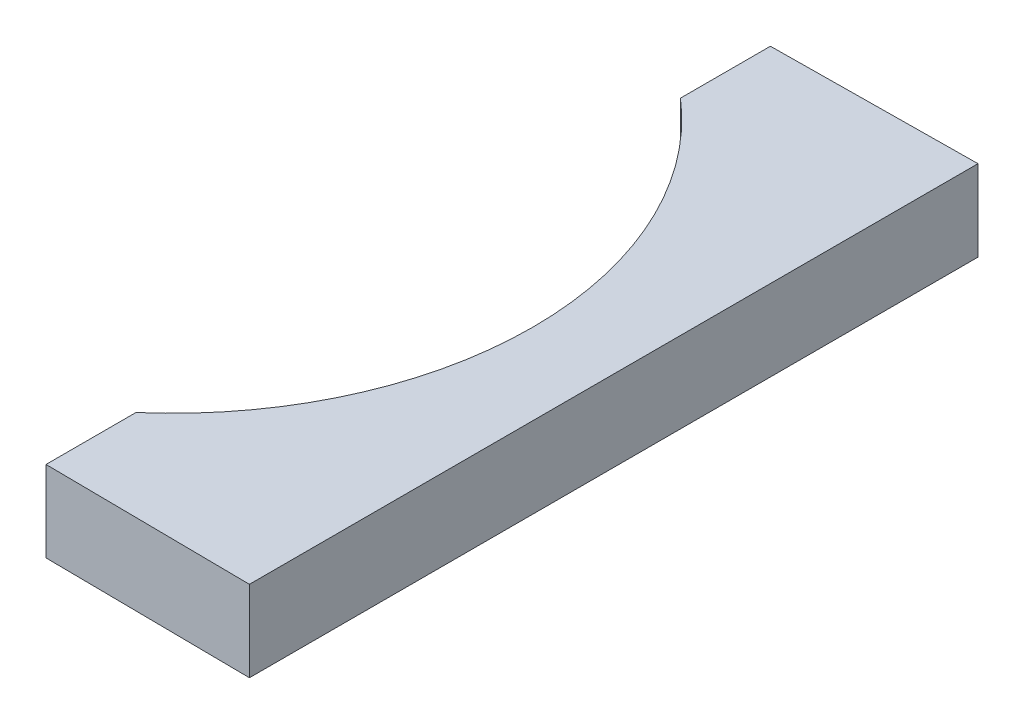
ISO-10303-21;
HEADER;
FILE_DESCRIPTION(('STEP AP214'),'2;1');
FILE_NAME('part.step','',(''),(''),'','','');
FILE_SCHEMA(('AUTOMOTIVE_DESIGN { 1 0 10303 214 1 1 1 1 }'));
ENDSEC;
DATA;
#1=APPLICATION_CONTEXT('core data for automotive mechanical design processes');
#2=APPLICATION_PROTOCOL_DEFINITION('international standard','automotive_design',2000,#1);
#3=PRODUCT_CONTEXT('',#1,'mechanical');
#4=PRODUCT('Part','Part','',(#3));
#5=PRODUCT_RELATED_PRODUCT_CATEGORY('part','',(#4));
#6=PRODUCT_DEFINITION_FORMATION('','',#4);
#7=PRODUCT_DEFINITION_CONTEXT('part definition',#1,'design');
#8=PRODUCT_DEFINITION('design','',#6,#7);
#9=PRODUCT_DEFINITION_SHAPE('','',#8);
#10=(LENGTH_UNIT() NAMED_UNIT(*) SI_UNIT(.MILLI.,.METRE.));
#11=(NAMED_UNIT(*) PLANE_ANGLE_UNIT() SI_UNIT($,.RADIAN.));
#12=(NAMED_UNIT(*) SI_UNIT($,.STERADIAN.) SOLID_ANGLE_UNIT());
#13=UNCERTAINTY_MEASURE_WITH_UNIT(LENGTH_MEASURE(1.E-05),#10,'distance_accuracy_value','');
#14=(GEOMETRIC_REPRESENTATION_CONTEXT(3) GLOBAL_UNCERTAINTY_ASSIGNED_CONTEXT((#13)) GLOBAL_UNIT_ASSIGNED_CONTEXT((#10,
#11,#12)) REPRESENTATION_CONTEXT('',''));
#15=CARTESIAN_POINT('',(0.,0.,0.));
#16=DIRECTION('',(0.,0.,1.));
#17=DIRECTION('',(1.,0.,0.));
#18=AXIS2_PLACEMENT_3D('',#15,#16,#17);
#19=CARTESIAN_POINT('',(2.6151815853578,0.9,0.));
#20=DIRECTION('',(1.,0.,0.));
#21=DIRECTION('',(0.,0.,-1.));
#22=AXIS2_PLACEMENT_3D('',#19,#20,#21);
#23=PLANE('',#22);
#24=DIRECTION('',(0.,0.,1.));
#25=VECTOR('',#24,1.);
#26=CARTESIAN_POINT('',(2.6151815853578,0.,0.));
#27=LINE('',#26,#25);
#28=CARTESIAN_POINT('',(2.6151815853578,0.,-4.0266855263812));
#29=VERTEX_POINT('',#28);
#30=CARTESIAN_POINT('',(2.6151815853578,0.,-3.0266855263812));
#31=VERTEX_POINT('',#30);
#32=EDGE_CURVE('E117',#29,#31,#27,.T.);
#33=ORIENTED_EDGE('',*,*,#32,.T.);
#34=DIRECTION('',(0.,-1.,0.));
#35=VECTOR('',#34,1.);
#36=CARTESIAN_POINT('',(2.6151815853578,0.9,-3.0266855263812));
#37=LINE('',#36,#35);
#38=CARTESIAN_POINT('',(2.6151815853578,0.9,-3.0266855263812));
#39=VERTEX_POINT('',#38);
#40=EDGE_CURVE('E11',#39,#31,#37,.T.);
#41=ORIENTED_EDGE('',*,*,#40,.F.);
#42=DIRECTION('',(0.,0.,1.));
#43=VECTOR('',#42,1.);
#44=CARTESIAN_POINT('',(2.6151815853578,0.9,0.));
#45=LINE('',#44,#43);
#46=CARTESIAN_POINT('',(2.6151815853578,0.9,-4.0266855263812));
#47=VERTEX_POINT('',#46);
#48=EDGE_CURVE('E131',#47,#39,#45,.T.);
#49=ORIENTED_EDGE('',*,*,#48,.F.);
#50=DIRECTION('',(0.,-1.,0.));
#51=VECTOR('',#50,1.);
#52=CARTESIAN_POINT('',(2.6151815853578,0.9,-4.0266855263812));
#53=LINE('',#52,#51);
#54=EDGE_CURVE('E49',#47,#29,#53,.T.);
#55=ORIENTED_EDGE('',*,*,#54,.T.);
#56=EDGE_LOOP('',(#33,#41,#49,#55));
#57=FACE_BOUND('',#56,.T.);
#58=ADVANCED_FACE('F33',(#57),#23,.F.);
#59=CARTESIAN_POINT('',(0.,0.9,0.));
#60=DIRECTION('',(0.,-1.,0.));
#61=DIRECTION('',(0.,0.,-1.));
#62=AXIS2_PLACEMENT_3D('',#59,#60,#61);
#63=CYLINDRICAL_SURFACE('',#62,4.);
#64=CARTESIAN_POINT('',(0.,0.,0.));
#65=DIRECTION('',(0.,1.,0.));
#66=DIRECTION('',(0.,0.,1.));
#67=AXIS2_PLACEMENT_3D('',#64,#65,#66);
#68=CIRCLE('',#67,4.);
#69=CARTESIAN_POINT('',(2.6151815853578,0.,3.0266855263812));
#70=VERTEX_POINT('',#69);
#71=EDGE_CURVE('E119',#31,#70,#68,.F.);
#72=ORIENTED_EDGE('',*,*,#71,.T.);
#73=DIRECTION('',(0.,-1.,0.));
#74=VECTOR('',#73,1.);
#75=CARTESIAN_POINT('',(2.6151815853578,0.9,3.0266855263812));
#76=LINE('',#75,#74);
#77=CARTESIAN_POINT('',(2.6151815853578,0.9,3.0266855263812));
#78=VERTEX_POINT('',#77);
#79=EDGE_CURVE('E41',#78,#70,#76,.T.);
#80=ORIENTED_EDGE('',*,*,#79,.F.);
#81=CARTESIAN_POINT('',(0.,0.9,0.));
#82=DIRECTION('',(0.,1.,0.));
#83=DIRECTION('',(0.,0.,1.));
#84=AXIS2_PLACEMENT_3D('',#81,#82,#83);
#85=CIRCLE('',#84,4.);
#86=EDGE_CURVE('E81',#39,#78,#85,.F.);
#87=ORIENTED_EDGE('',*,*,#86,.F.);
#88=ORIENTED_EDGE('',*,*,#40,.T.);
#89=EDGE_LOOP('',(#72,#80,#87,#88));
#90=FACE_BOUND('',#89,.T.);
#91=ADVANCED_FACE('F137',(#90),#63,.F.);
#92=CARTESIAN_POINT('',(2.6151815853578,0.9,0.));
#93=DIRECTION('',(-1.,0.,0.));
#94=DIRECTION('',(0.,0.,1.));
#95=AXIS2_PLACEMENT_3D('',#92,#93,#94);
#96=PLANE('',#95);
#97=DIRECTION('',(0.,0.,-1.));
#98=VECTOR('',#97,1.);
#99=CARTESIAN_POINT('',(2.6151815853578,0.,0.));
#100=LINE('',#99,#98);
#101=CARTESIAN_POINT('',(2.6151815853578,0.,4.0266855263812));
#102=VERTEX_POINT('',#101);
#103=EDGE_CURVE('E122',#102,#70,#100,.T.);
#104=ORIENTED_EDGE('',*,*,#103,.F.);
#105=DIRECTION('',(0.,-1.,0.));
#106=VECTOR('',#105,1.);
#107=CARTESIAN_POINT('',(2.6151815853578,0.9,4.0266855263812));
#108=LINE('',#107,#106);
#109=CARTESIAN_POINT('',(2.6151815853578,0.9,4.0266855263812));
#110=VERTEX_POINT('',#109);
#111=EDGE_CURVE('E100',#110,#102,#108,.T.);
#112=ORIENTED_EDGE('',*,*,#111,.F.);
#113=DIRECTION('',(0.,0.,-1.));
#114=VECTOR('',#113,1.);
#115=CARTESIAN_POINT('',(2.6151815853578,0.9,0.));
#116=LINE('',#115,#114);
#117=EDGE_CURVE('E109',#110,#78,#116,.T.);
#118=ORIENTED_EDGE('',*,*,#117,.T.);
#119=ORIENTED_EDGE('',*,*,#79,.T.);
#120=EDGE_LOOP('',(#104,#112,#118,#119));
#121=FACE_BOUND('',#120,.T.);
#122=ADVANCED_FACE('F136',(#121),#96,.T.);
#123=CARTESIAN_POINT('',(-0.0408120770432083,0.9,3.99958355023425));
#124=DIRECTION('',(-0.0102035504329013,0.,0.999947942424286));
#125=DIRECTION('',(0.999947942424286,0.,0.0102035504329013));
#126=AXIS2_PLACEMENT_3D('',#123,#124,#125);
#127=PLANE('',#126);
#128=DIRECTION('',(-0.999947942424286,0.,-0.0102035504329013));
#129=VECTOR('',#128,1.);
#130=CARTESIAN_POINT('',(-0.0408120770432083,0.,3.99958355023425));
#131=LINE('',#130,#129);
#132=CARTESIAN_POINT('',(4.9,0.,4.05));
#133=VERTEX_POINT('',#132);
#134=EDGE_CURVE('E96',#133,#102,#131,.T.);
#135=ORIENTED_EDGE('',*,*,#134,.F.);
#136=DIRECTION('',(0.,-1.,0.));
#137=VECTOR('',#136,1.);
#138=CARTESIAN_POINT('',(4.9,0.9,4.05));
#139=LINE('',#138,#137);
#140=CARTESIAN_POINT('',(4.9,0.9,4.05));
#141=VERTEX_POINT('',#140);
#142=EDGE_CURVE('E91',#141,#133,#139,.T.);
#143=ORIENTED_EDGE('',*,*,#142,.F.);
#144=DIRECTION('',(-0.999947942424286,0.,-0.0102035504329013));
#145=VECTOR('',#144,1.);
#146=CARTESIAN_POINT('',(-0.0408120770432083,0.9,3.99958355023425));
#147=LINE('',#146,#145);
#148=EDGE_CURVE('E94',#141,#110,#147,.T.);
#149=ORIENTED_EDGE('',*,*,#148,.T.);
#150=ORIENTED_EDGE('',*,*,#111,.T.);
#151=EDGE_LOOP('',(#135,#143,#149,#150));
#152=FACE_BOUND('',#151,.T.);
#153=ADVANCED_FACE('F93',(#152),#127,.T.);
#154=CARTESIAN_POINT('',(4.9,0.9,0.));
#155=DIRECTION('',(1.,0.,0.));
#156=DIRECTION('',(0.,0.,-1.));
#157=AXIS2_PLACEMENT_3D('',#154,#155,#156);
#158=PLANE('',#157);
#159=DIRECTION('',(0.,0.,1.));
#160=VECTOR('',#159,1.);
#161=CARTESIAN_POINT('',(4.9,0.,0.));
#162=LINE('',#161,#160);
#163=CARTESIAN_POINT('',(4.9,0.,-4.05));
#164=VERTEX_POINT('',#163);
#165=EDGE_CURVE('E126',#164,#133,#162,.T.);
#166=ORIENTED_EDGE('',*,*,#165,.F.);
#167=DIRECTION('',(0.,-1.,0.));
#168=VECTOR('',#167,1.);
#169=CARTESIAN_POINT('',(4.9,0.9,-4.05));
#170=LINE('',#169,#168);
#171=CARTESIAN_POINT('',(4.9,0.9,-4.05));
#172=VERTEX_POINT('',#171);
#173=EDGE_CURVE('E69',#172,#164,#170,.T.);
#174=ORIENTED_EDGE('',*,*,#173,.F.);
#175=DIRECTION('',(0.,0.,1.));
#176=VECTOR('',#175,1.);
#177=CARTESIAN_POINT('',(4.9,0.9,0.));
#178=LINE('',#177,#176);
#179=EDGE_CURVE('E107',#172,#141,#178,.T.);
#180=ORIENTED_EDGE('',*,*,#179,.T.);
#181=ORIENTED_EDGE('',*,*,#142,.T.);
#182=EDGE_LOOP('',(#166,#174,#180,#181));
#183=FACE_BOUND('',#182,.T.);
#184=ADVANCED_FACE('F111',(#183),#158,.T.);
#185=CARTESIAN_POINT('',(-0.0408120770432083,0.9,-3.99958355023425));
#186=DIRECTION('',(-0.0102035504329013,0.,-0.999947942424286));
#187=DIRECTION('',(-0.999947942424286,0.,0.0102035504329013));
#188=AXIS2_PLACEMENT_3D('',#185,#186,#187);
#189=PLANE('',#188);
#190=DIRECTION('',(0.999947942424286,0.,-0.0102035504329013));
#191=VECTOR('',#190,1.);
#192=CARTESIAN_POINT('',(-0.0408120770432083,0.,-3.99958355023425));
#193=LINE('',#192,#191);
#194=EDGE_CURVE('E128',#29,#164,#193,.T.);
#195=ORIENTED_EDGE('',*,*,#194,.F.);
#196=ORIENTED_EDGE('',*,*,#54,.F.);
#197=DIRECTION('',(0.999947942424286,0.,-0.0102035504329013));
#198=VECTOR('',#197,1.);
#199=CARTESIAN_POINT('',(-0.0408120770432083,0.9,-3.99958355023425));
#200=LINE('',#199,#198);
#201=EDGE_CURVE('E112',#47,#172,#200,.T.);
#202=ORIENTED_EDGE('',*,*,#201,.T.);
#203=ORIENTED_EDGE('',*,*,#173,.T.);
#204=EDGE_LOOP('',(#195,#196,#202,#203));
#205=FACE_BOUND('',#204,.T.);
#206=ADVANCED_FACE('F141',(#205),#189,.T.);
#207=CARTESIAN_POINT('',(0.,0.9,0.));
#208=DIRECTION('',(0.,1.,0.));
#209=DIRECTION('',(0.,0.,1.));
#210=AXIS2_PLACEMENT_3D('',#207,#208,#209);
#211=PLANE('',#210);
#212=ORIENTED_EDGE('',*,*,#48,.T.);
#213=ORIENTED_EDGE('',*,*,#86,.T.);
#214=ORIENTED_EDGE('',*,*,#117,.F.);
#215=ORIENTED_EDGE('',*,*,#148,.F.);
#216=ORIENTED_EDGE('',*,*,#179,.F.);
#217=ORIENTED_EDGE('',*,*,#201,.F.);
#218=EDGE_LOOP('',(#212,#213,#214,#215,#216,#217));
#219=FACE_BOUND('',#218,.T.);
#220=ADVANCED_FACE('F105',(#219),#211,.T.);
#221=CARTESIAN_POINT('',(0.,0.,0.));
#222=DIRECTION('',(0.,1.,0.));
#223=DIRECTION('',(0.,0.,1.));
#224=AXIS2_PLACEMENT_3D('',#221,#222,#223);
#225=PLANE('',#224);
#226=ORIENTED_EDGE('',*,*,#32,.F.);
#227=ORIENTED_EDGE('',*,*,#194,.T.);
#228=ORIENTED_EDGE('',*,*,#165,.T.);
#229=ORIENTED_EDGE('',*,*,#134,.T.);
#230=ORIENTED_EDGE('',*,*,#103,.T.);
#231=ORIENTED_EDGE('',*,*,#71,.F.);
#232=EDGE_LOOP('',(#226,#227,#228,#229,#230,#231));
#233=FACE_BOUND('',#232,.T.);
#234=ADVANCED_FACE('F140',(#233),#225,.F.);
#235=CLOSED_SHELL('',(#58,#91,#122,#153,#184,#206,#220,#234));
#236=MANIFOLD_SOLID_BREP('B2',#235);
#237=ADVANCED_BREP_SHAPE_REPRESENTATION('',(#18,#236),#14);
#238=SHAPE_DEFINITION_REPRESENTATION(#9,#237);
ENDSEC;
END-ISO-10303-21;
